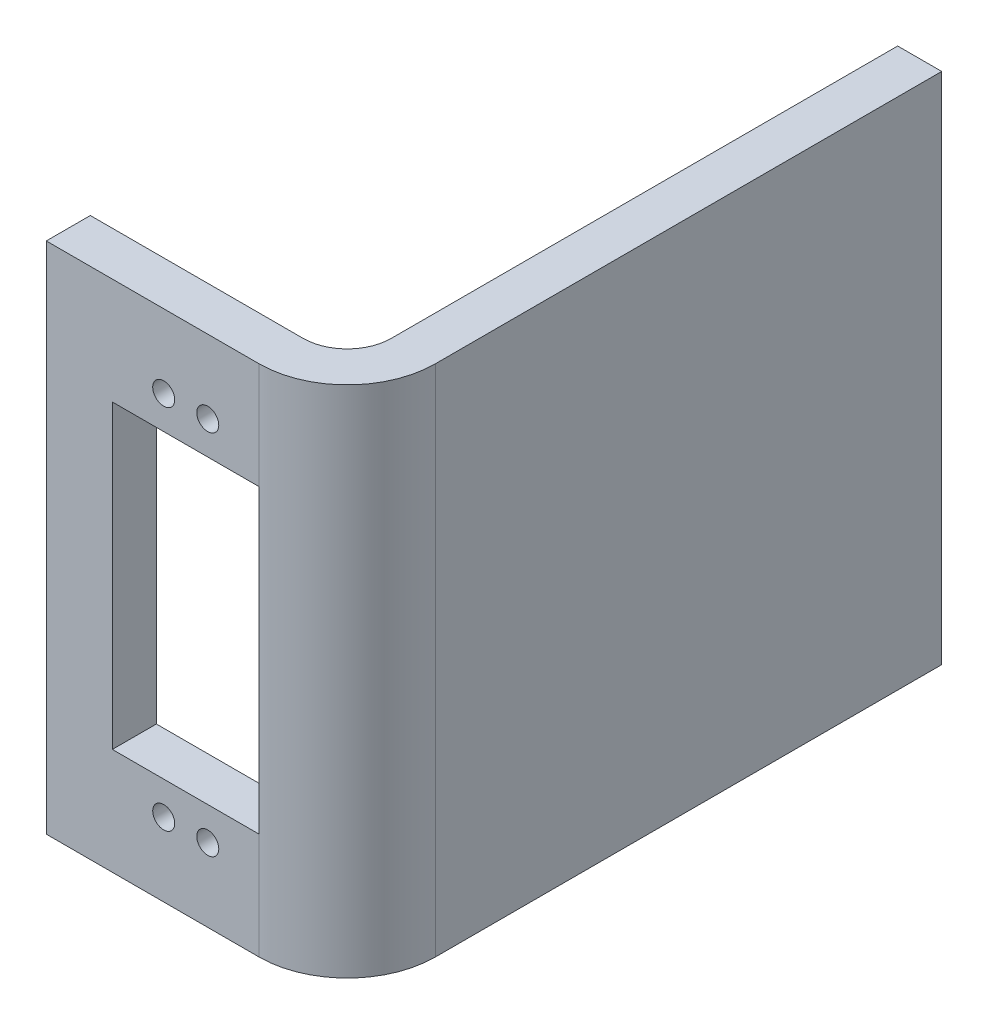
ISO-10303-21;
HEADER;
FILE_DESCRIPTION(('STEP AP214'),'2;1');
FILE_NAME('part.step','',(''),(''),'','','');
FILE_SCHEMA(('AUTOMOTIVE_DESIGN { 1 0 10303 214 1 1 1 1 }'));
ENDSEC;
DATA;
#1=APPLICATION_CONTEXT('core data for automotive mechanical design processes');
#2=APPLICATION_PROTOCOL_DEFINITION('international standard','automotive_design',2000,#1);
#3=PRODUCT_CONTEXT('',#1,'mechanical');
#4=PRODUCT('Part','Part','',(#3));
#5=PRODUCT_RELATED_PRODUCT_CATEGORY('part','',(#4));
#6=PRODUCT_DEFINITION_FORMATION('','',#4);
#7=PRODUCT_DEFINITION_CONTEXT('part definition',#1,'design');
#8=PRODUCT_DEFINITION('design','',#6,#7);
#9=PRODUCT_DEFINITION_SHAPE('','',#8);
#10=(LENGTH_UNIT() NAMED_UNIT(*) SI_UNIT(.MILLI.,.METRE.));
#11=(NAMED_UNIT(*) PLANE_ANGLE_UNIT() SI_UNIT($,.RADIAN.));
#12=(NAMED_UNIT(*) SI_UNIT($,.STERADIAN.) SOLID_ANGLE_UNIT());
#13=UNCERTAINTY_MEASURE_WITH_UNIT(LENGTH_MEASURE(1.E-05),#10,'distance_accuracy_value','');
#14=(GEOMETRIC_REPRESENTATION_CONTEXT(3) GLOBAL_UNCERTAINTY_ASSIGNED_CONTEXT((#13)) GLOBAL_UNIT_ASSIGNED_CONTEXT((#10,
#11,#12)) REPRESENTATION_CONTEXT('',''));
#15=CARTESIAN_POINT('',(0.,0.,0.));
#16=DIRECTION('',(0.,0.,1.));
#17=DIRECTION('',(1.,0.,0.));
#18=AXIS2_PLACEMENT_3D('',#15,#16,#17);
#19=CARTESIAN_POINT('',(-5.99999999999999,70.,69.));
#20=DIRECTION('',(0.,-1.,0.));
#21=DIRECTION('',(0.,0.,-1.));
#22=AXIS2_PLACEMENT_3D('',#19,#20,#21);
#23=CYLINDRICAL_SURFACE('',#22,12.);
#24=CARTESIAN_POINT('',(-5.99999999999999,0.,69.));
#25=DIRECTION('',(0.,1.,0.));
#26=DIRECTION('',(0.,0.,1.));
#27=AXIS2_PLACEMENT_3D('',#24,#25,#26);
#28=CIRCLE('',#27,12.);
#29=CARTESIAN_POINT('',(6.,0.,68.9999999999999));
#30=VERTEX_POINT('',#29);
#31=CARTESIAN_POINT('',(-6.00000000000008,0.,81.));
#32=VERTEX_POINT('',#31);
#33=EDGE_CURVE('E184',#30,#32,#28,.F.);
#34=ORIENTED_EDGE('',*,*,#33,.F.);
#35=DIRECTION('',(0.,-1.,0.));
#36=VECTOR('',#35,1.);
#37=CARTESIAN_POINT('',(6.,70.,68.9999999999999));
#38=LINE('',#37,#36);
#39=CARTESIAN_POINT('',(6.,70.,68.9999999999999));
#40=VERTEX_POINT('',#39);
#41=EDGE_CURVE('E11',#40,#30,#38,.T.);
#42=ORIENTED_EDGE('',*,*,#41,.F.);
#43=CARTESIAN_POINT('',(-5.99999999999999,70.,69.));
#44=DIRECTION('',(0.,1.,0.));
#45=DIRECTION('',(0.,0.,1.));
#46=AXIS2_PLACEMENT_3D('',#43,#44,#45);
#47=CIRCLE('',#46,12.);
#48=CARTESIAN_POINT('',(-6.00000000000008,70.,81.));
#49=VERTEX_POINT('',#48);
#50=EDGE_CURVE('E185',#40,#49,#47,.F.);
#51=ORIENTED_EDGE('',*,*,#50,.T.);
#52=DIRECTION('',(0.,-1.,0.));
#53=VECTOR('',#52,1.);
#54=CARTESIAN_POINT('',(-6.00000000000008,70.,81.));
#55=LINE('',#54,#53);
#56=CARTESIAN_POINT('',(-6.00000000000008,55.5,81.));
#57=VERTEX_POINT('',#56);
#58=EDGE_CURVE('E227',#49,#57,#55,.T.);
#59=ORIENTED_EDGE('',*,*,#58,.T.);
#60=DIRECTION('',(0.,1.,0.));
#61=VECTOR('',#60,1.);
#62=CARTESIAN_POINT('',(-6.00000000000008,55.5,81.));
#63=LINE('',#62,#61);
#64=CARTESIAN_POINT('',(-6.00000000000007,14.5,81.));
#65=VERTEX_POINT('',#64);
#66=EDGE_CURVE('E56',#65,#57,#63,.T.);
#67=ORIENTED_EDGE('',*,*,#66,.F.);
#68=EDGE_CURVE('E206',#65,#32,#55,.T.);
#69=ORIENTED_EDGE('',*,*,#68,.T.);
#70=EDGE_LOOP('',(#34,#42,#51,#59,#67,#69));
#71=FACE_BOUND('',#70,.T.);
#72=ADVANCED_FACE('F34',(#71),#23,.T.);
#73=CARTESIAN_POINT('',(6.,70.,0.));
#74=DIRECTION('',(1.,0.,0.));
#75=DIRECTION('',(0.,0.,-1.));
#76=AXIS2_PLACEMENT_3D('',#73,#74,#75);
#77=PLANE('',#76);
#78=DIRECTION('',(0.,0.,1.));
#79=VECTOR('',#78,1.);
#80=CARTESIAN_POINT('',(6.,0.,0.));
#81=LINE('',#80,#79);
#82=CARTESIAN_POINT('',(6.,0.,0.));
#83=VERTEX_POINT('',#82);
#84=EDGE_CURVE('E209',#83,#30,#81,.T.);
#85=ORIENTED_EDGE('',*,*,#84,.F.);
#86=DIRECTION('',(0.,-1.,0.));
#87=VECTOR('',#86,1.);
#88=CARTESIAN_POINT('',(6.,70.,0.));
#89=LINE('',#88,#87);
#90=CARTESIAN_POINT('',(6.,70.,0.));
#91=VERTEX_POINT('',#90);
#92=EDGE_CURVE('E41',#91,#83,#89,.T.);
#93=ORIENTED_EDGE('',*,*,#92,.F.);
#94=DIRECTION('',(0.,0.,1.));
#95=VECTOR('',#94,1.);
#96=CARTESIAN_POINT('',(6.,70.,0.));
#97=LINE('',#96,#95);
#98=EDGE_CURVE('E188',#91,#40,#97,.T.);
#99=ORIENTED_EDGE('',*,*,#98,.T.);
#100=ORIENTED_EDGE('',*,*,#41,.T.);
#101=EDGE_LOOP('',(#85,#93,#99,#100));
#102=FACE_BOUND('',#101,.T.);
#103=ADVANCED_FACE('F249',(#102),#77,.T.);
#104=CARTESIAN_POINT('',(0.,70.,0.));
#105=DIRECTION('',(0.,0.,-1.));
#106=DIRECTION('',(-1.,0.,0.));
#107=AXIS2_PLACEMENT_3D('',#104,#105,#106);
#108=PLANE('',#107);
#109=DIRECTION('',(1.,0.,0.));
#110=VECTOR('',#109,1.);
#111=CARTESIAN_POINT('',(0.,0.,0.));
#112=LINE('',#111,#110);
#113=CARTESIAN_POINT('',(0.,0.,0.));
#114=VERTEX_POINT('',#113);
#115=EDGE_CURVE('E212',#114,#83,#112,.T.);
#116=ORIENTED_EDGE('',*,*,#115,.F.);
#117=DIRECTION('',(0.,-1.,0.));
#118=VECTOR('',#117,1.);
#119=CARTESIAN_POINT('',(0.,70.,0.));
#120=LINE('',#119,#118);
#121=CARTESIAN_POINT('',(0.,70.,0.));
#122=VERTEX_POINT('',#121);
#123=EDGE_CURVE('E241',#122,#114,#120,.T.);
#124=ORIENTED_EDGE('',*,*,#123,.F.);
#125=DIRECTION('',(1.,0.,0.));
#126=VECTOR('',#125,1.);
#127=CARTESIAN_POINT('',(0.,70.,0.));
#128=LINE('',#127,#126);
#129=EDGE_CURVE('E192',#122,#91,#128,.T.);
#130=ORIENTED_EDGE('',*,*,#129,.T.);
#131=ORIENTED_EDGE('',*,*,#92,.T.);
#132=EDGE_LOOP('',(#116,#124,#130,#131));
#133=FACE_BOUND('',#132,.T.);
#134=ADVANCED_FACE('F245',(#133),#108,.T.);
#135=CARTESIAN_POINT('',(0.,70.,0.));
#136=DIRECTION('',(1.,0.,0.));
#137=DIRECTION('',(0.,0.,-1.));
#138=AXIS2_PLACEMENT_3D('',#135,#136,#137);
#139=PLANE('',#138);
#140=DIRECTION('',(0.,0.,1.));
#141=VECTOR('',#140,1.);
#142=CARTESIAN_POINT('',(0.,0.,0.));
#143=LINE('',#142,#141);
#144=CARTESIAN_POINT('',(0.,0.,68.9999999999999));
#145=VERTEX_POINT('',#144);
#146=EDGE_CURVE('E215',#114,#145,#143,.T.);
#147=ORIENTED_EDGE('',*,*,#146,.T.);
#148=DIRECTION('',(0.,-1.,0.));
#149=VECTOR('',#148,1.);
#150=CARTESIAN_POINT('',(0.,70.,68.9999999999999));
#151=LINE('',#150,#149);
#152=CARTESIAN_POINT('',(0.,70.,68.9999999999999));
#153=VERTEX_POINT('',#152);
#154=EDGE_CURVE('E238',#153,#145,#151,.T.);
#155=ORIENTED_EDGE('',*,*,#154,.F.);
#156=DIRECTION('',(0.,0.,1.));
#157=VECTOR('',#156,1.);
#158=CARTESIAN_POINT('',(0.,70.,0.));
#159=LINE('',#158,#157);
#160=EDGE_CURVE('E195',#122,#153,#159,.T.);
#161=ORIENTED_EDGE('',*,*,#160,.F.);
#162=ORIENTED_EDGE('',*,*,#123,.T.);
#163=EDGE_LOOP('',(#147,#155,#161,#162));
#164=FACE_BOUND('',#163,.T.);
#165=ADVANCED_FACE('F258',(#164),#139,.F.);
#166=CARTESIAN_POINT('',(-5.99999999999999,70.,69.));
#167=DIRECTION('',(0.,-1.,0.));
#168=DIRECTION('',(0.,0.,-1.));
#169=AXIS2_PLACEMENT_3D('',#166,#167,#168);
#170=CYLINDRICAL_SURFACE('',#169,5.99999999999999);
#171=CARTESIAN_POINT('',(-5.99999999999999,0.,69.));
#172=DIRECTION('',(0.,1.,0.));
#173=DIRECTION('',(0.,0.,1.));
#174=AXIS2_PLACEMENT_3D('',#171,#172,#173);
#175=CIRCLE('',#174,5.99999999999999);
#176=CARTESIAN_POINT('',(-6.00000000000003,0.,75.));
#177=VERTEX_POINT('',#176);
#178=EDGE_CURVE('E217',#145,#177,#175,.F.);
#179=ORIENTED_EDGE('',*,*,#178,.T.);
#180=DIRECTION('',(0.,-1.,0.));
#181=VECTOR('',#180,1.);
#182=CARTESIAN_POINT('',(-6.00000000000003,70.,75.));
#183=LINE('',#182,#181);
#184=CARTESIAN_POINT('',(-6.00000000000007,14.5,75.));
#185=VERTEX_POINT('',#184);
#186=EDGE_CURVE('E234',#185,#177,#183,.T.);
#187=ORIENTED_EDGE('',*,*,#186,.F.);
#188=DIRECTION('',(0.,1.,0.));
#189=VECTOR('',#188,1.);
#190=CARTESIAN_POINT('',(-6.00000000000008,70.,75.));
#191=LINE('',#190,#189);
#192=CARTESIAN_POINT('',(-6.00000000000008,55.5,75.));
#193=VERTEX_POINT('',#192);
#194=EDGE_CURVE('E157',#185,#193,#191,.T.);
#195=ORIENTED_EDGE('',*,*,#194,.T.);
#196=CARTESIAN_POINT('',(-6.00000000000003,70.,75.));
#197=VERTEX_POINT('',#196);
#198=EDGE_CURVE('E235',#197,#193,#183,.T.);
#199=ORIENTED_EDGE('',*,*,#198,.F.);
#200=CARTESIAN_POINT('',(-5.99999999999999,70.,69.));
#201=DIRECTION('',(0.,1.,0.));
#202=DIRECTION('',(0.,0.,1.));
#203=AXIS2_PLACEMENT_3D('',#200,#201,#202);
#204=CIRCLE('',#203,5.99999999999999);
#205=EDGE_CURVE('E197',#153,#197,#204,.F.);
#206=ORIENTED_EDGE('',*,*,#205,.F.);
#207=ORIENTED_EDGE('',*,*,#154,.T.);
#208=EDGE_LOOP('',(#179,#187,#195,#199,#206,#207));
#209=FACE_BOUND('',#208,.T.);
#210=ADVANCED_FACE('F262',(#209),#170,.F.);
#211=CARTESIAN_POINT('',(0.,70.,75.));
#212=DIRECTION('',(0.,0.,1.));
#213=DIRECTION('',(1.,0.,0.));
#214=AXIS2_PLACEMENT_3D('',#211,#212,#213);
#215=PLANE('',#214);
#216=CARTESIAN_POINT('',(-19.0000000000001,10.,75.));
#217=DIRECTION('',(0.,0.,1.));
#218=DIRECTION('',(1.,0.,0.));
#219=AXIS2_PLACEMENT_3D('',#216,#217,#218);
#220=CIRCLE('',#219,1.5);
#221=CARTESIAN_POINT('',(-17.5000000000001,10.,75.));
#222=VERTEX_POINT('',#221);
#223=EDGE_CURVE('E163',#222,#222,#220,.T.);
#224=ORIENTED_EDGE('',*,*,#223,.T.);
#225=EDGE_LOOP('',(#224));
#226=FACE_BOUND('',#225,.T.);
#227=CARTESIAN_POINT('',(-13.0000000000001,10.,75.));
#228=DIRECTION('',(0.,0.,1.));
#229=DIRECTION('',(1.,0.,0.));
#230=AXIS2_PLACEMENT_3D('',#227,#228,#229);
#231=CIRCLE('',#230,1.5);
#232=CARTESIAN_POINT('',(-11.5000000000001,10.,75.));
#233=VERTEX_POINT('',#232);
#234=EDGE_CURVE('E169',#233,#233,#231,.T.);
#235=ORIENTED_EDGE('',*,*,#234,.T.);
#236=EDGE_LOOP('',(#235));
#237=FACE_BOUND('',#236,.T.);
#238=CARTESIAN_POINT('',(-13.0000000000001,60.,75.));
#239=DIRECTION('',(0.,0.,1.));
#240=DIRECTION('',(1.,0.,0.));
#241=AXIS2_PLACEMENT_3D('',#238,#239,#240);
#242=CIRCLE('',#241,1.5);
#243=CARTESIAN_POINT('',(-11.5000000000001,60.,75.));
#244=VERTEX_POINT('',#243);
#245=EDGE_CURVE('E175',#244,#244,#242,.T.);
#246=ORIENTED_EDGE('',*,*,#245,.T.);
#247=EDGE_LOOP('',(#246));
#248=FACE_BOUND('',#247,.T.);
#249=CARTESIAN_POINT('',(-19.0000000000001,60.,75.));
#250=DIRECTION('',(0.,0.,1.));
#251=DIRECTION('',(1.,0.,0.));
#252=AXIS2_PLACEMENT_3D('',#249,#250,#251);
#253=CIRCLE('',#252,1.5);
#254=CARTESIAN_POINT('',(-17.5000000000001,60.,75.));
#255=VERTEX_POINT('',#254);
#256=EDGE_CURVE('E181',#255,#255,#253,.T.);
#257=ORIENTED_EDGE('',*,*,#256,.T.);
#258=EDGE_LOOP('',(#257));
#259=FACE_BOUND('',#258,.T.);
#260=DIRECTION('',(0.,-1.,0.));
#261=VECTOR('',#260,1.);
#262=CARTESIAN_POINT('',(-26.0000000000001,70.,75.));
#263=LINE('',#262,#261);
#264=CARTESIAN_POINT('',(-26.0000000000001,55.5,75.));
#265=VERTEX_POINT('',#264);
#266=CARTESIAN_POINT('',(-26.0000000000001,14.5,75.));
#267=VERTEX_POINT('',#266);
#268=EDGE_CURVE('E127',#265,#267,#263,.T.);
#269=ORIENTED_EDGE('',*,*,#268,.T.);
#270=DIRECTION('',(1.,0.,0.));
#271=VECTOR('',#270,1.);
#272=CARTESIAN_POINT('',(0.,14.5,75.));
#273=LINE('',#272,#271);
#274=EDGE_CURVE('E154',#267,#185,#273,.T.);
#275=ORIENTED_EDGE('',*,*,#274,.T.);
#276=ORIENTED_EDGE('',*,*,#186,.T.);
#277=DIRECTION('',(-1.,0.,0.));
#278=VECTOR('',#277,1.);
#279=CARTESIAN_POINT('',(0.,0.,75.));
#280=LINE('',#279,#278);
#281=CARTESIAN_POINT('',(-35.,0.,75.));
#282=VERTEX_POINT('',#281);
#283=EDGE_CURVE('E220',#177,#282,#280,.T.);
#284=ORIENTED_EDGE('',*,*,#283,.T.);
#285=DIRECTION('',(0.,-1.,0.));
#286=VECTOR('',#285,1.);
#287=CARTESIAN_POINT('',(-35.,70.,75.));
#288=LINE('',#287,#286);
#289=CARTESIAN_POINT('',(-35.,70.,75.));
#290=VERTEX_POINT('',#289);
#291=EDGE_CURVE('E231',#290,#282,#288,.T.);
#292=ORIENTED_EDGE('',*,*,#291,.F.);
#293=DIRECTION('',(-1.,0.,0.));
#294=VECTOR('',#293,1.);
#295=CARTESIAN_POINT('',(0.,70.,75.));
#296=LINE('',#295,#294);
#297=EDGE_CURVE('E199',#197,#290,#296,.T.);
#298=ORIENTED_EDGE('',*,*,#297,.F.);
#299=ORIENTED_EDGE('',*,*,#198,.T.);
#300=DIRECTION('',(-1.,0.,0.));
#301=VECTOR('',#300,1.);
#302=CARTESIAN_POINT('',(0.,55.5,75.));
#303=LINE('',#302,#301);
#304=EDGE_CURVE('E149',#193,#265,#303,.T.);
#305=ORIENTED_EDGE('',*,*,#304,.T.);
#306=EDGE_LOOP('',(#269,#275,#276,#284,#292,#298,#299,#305));
#307=FACE_BOUND('',#306,.T.);
#308=ADVANCED_FACE('F279',(#226,#237,#248,#259,#307),#215,.F.);
#309=CARTESIAN_POINT('',(-35.0000000000001,70.,0.));
#310=DIRECTION('',(1.,0.,0.));
#311=DIRECTION('',(0.,0.,-1.));
#312=AXIS2_PLACEMENT_3D('',#309,#310,#311);
#313=PLANE('',#312);
#314=DIRECTION('',(0.,0.,1.));
#315=VECTOR('',#314,1.);
#316=CARTESIAN_POINT('',(-35.0000000000001,0.,0.));
#317=LINE('',#316,#315);
#318=CARTESIAN_POINT('',(-35.,0.,81.));
#319=VERTEX_POINT('',#318);
#320=EDGE_CURVE('E222',#282,#319,#317,.T.);
#321=ORIENTED_EDGE('',*,*,#320,.T.);
#322=DIRECTION('',(0.,-1.,0.));
#323=VECTOR('',#322,1.);
#324=CARTESIAN_POINT('',(-35.,70.,81.));
#325=LINE('',#324,#323);
#326=CARTESIAN_POINT('',(-35.,70.,81.));
#327=VERTEX_POINT('',#326);
#328=EDGE_CURVE('E229',#327,#319,#325,.T.);
#329=ORIENTED_EDGE('',*,*,#328,.F.);
#330=DIRECTION('',(0.,0.,1.));
#331=VECTOR('',#330,1.);
#332=CARTESIAN_POINT('',(-35.0000000000001,70.,0.));
#333=LINE('',#332,#331);
#334=EDGE_CURVE('E201',#290,#327,#333,.T.);
#335=ORIENTED_EDGE('',*,*,#334,.F.);
#336=ORIENTED_EDGE('',*,*,#291,.T.);
#337=EDGE_LOOP('',(#321,#329,#335,#336));
#338=FACE_BOUND('',#337,.T.);
#339=ADVANCED_FACE('F277',(#338),#313,.F.);
#340=CARTESIAN_POINT('',(0.,70.,81.));
#341=DIRECTION('',(0.,0.,1.));
#342=DIRECTION('',(1.,0.,0.));
#343=AXIS2_PLACEMENT_3D('',#340,#341,#342);
#344=PLANE('',#343);
#345=DIRECTION('',(1.,0.,0.));
#346=VECTOR('',#345,1.);
#347=CARTESIAN_POINT('',(-26.0000000000001,14.5,81.));
#348=LINE('',#347,#346);
#349=CARTESIAN_POINT('',(-26.0000000000001,14.5,81.));
#350=VERTEX_POINT('',#349);
#351=EDGE_CURVE('E142',#350,#65,#348,.T.);
#352=ORIENTED_EDGE('',*,*,#351,.F.);
#353=DIRECTION('',(0.,-1.,0.));
#354=VECTOR('',#353,1.);
#355=CARTESIAN_POINT('',(-26.0000000000001,55.5,81.));
#356=LINE('',#355,#354);
#357=CARTESIAN_POINT('',(-26.0000000000001,55.5,81.));
#358=VERTEX_POINT('',#357);
#359=EDGE_CURVE('E124',#358,#350,#356,.T.);
#360=ORIENTED_EDGE('',*,*,#359,.F.);
#361=DIRECTION('',(-1.,0.,0.));
#362=VECTOR('',#361,1.);
#363=CARTESIAN_POINT('',(-26.0000000000001,55.5,81.));
#364=LINE('',#363,#362);
#365=EDGE_CURVE('E133',#57,#358,#364,.T.);
#366=ORIENTED_EDGE('',*,*,#365,.F.);
#367=ORIENTED_EDGE('',*,*,#58,.F.);
#368=DIRECTION('',(-1.,0.,0.));
#369=VECTOR('',#368,1.);
#370=CARTESIAN_POINT('',(0.,70.,81.));
#371=LINE('',#370,#369);
#372=EDGE_CURVE('E203',#49,#327,#371,.T.);
#373=ORIENTED_EDGE('',*,*,#372,.T.);
#374=ORIENTED_EDGE('',*,*,#328,.T.);
#375=DIRECTION('',(-1.,0.,0.));
#376=VECTOR('',#375,1.);
#377=CARTESIAN_POINT('',(0.,0.,81.));
#378=LINE('',#377,#376);
#379=EDGE_CURVE('E189',#32,#319,#378,.T.);
#380=ORIENTED_EDGE('',*,*,#379,.F.);
#381=ORIENTED_EDGE('',*,*,#68,.F.);
#382=EDGE_LOOP('',(#352,#360,#366,#367,#373,#374,#380,#381));
#383=FACE_BOUND('',#382,.T.);
#384=CARTESIAN_POINT('',(-19.0000000000001,10.,81.));
#385=DIRECTION('',(0.,0.,1.));
#386=DIRECTION('',(-1.,0.,0.));
#387=AXIS2_PLACEMENT_3D('',#384,#385,#386);
#388=CIRCLE('',#387,1.5);
#389=CARTESIAN_POINT('',(-20.5000000000001,10.,81.));
#390=VERTEX_POINT('',#389);
#391=EDGE_CURVE('E160',#390,#390,#388,.T.);
#392=ORIENTED_EDGE('',*,*,#391,.F.);
#393=EDGE_LOOP('',(#392));
#394=FACE_BOUND('',#393,.T.);
#395=CARTESIAN_POINT('',(-13.0000000000001,10.,81.));
#396=DIRECTION('',(0.,0.,1.));
#397=DIRECTION('',(1.,0.,0.));
#398=AXIS2_PLACEMENT_3D('',#395,#396,#397);
#399=CIRCLE('',#398,1.5);
#400=CARTESIAN_POINT('',(-11.5000000000001,10.,81.));
#401=VERTEX_POINT('',#400);
#402=EDGE_CURVE('E166',#401,#401,#399,.T.);
#403=ORIENTED_EDGE('',*,*,#402,.F.);
#404=EDGE_LOOP('',(#403));
#405=FACE_BOUND('',#404,.T.);
#406=CARTESIAN_POINT('',(-13.0000000000001,60.,81.));
#407=DIRECTION('',(0.,0.,1.));
#408=DIRECTION('',(-1.,0.,0.));
#409=AXIS2_PLACEMENT_3D('',#406,#407,#408);
#410=CIRCLE('',#409,1.5);
#411=CARTESIAN_POINT('',(-14.5000000000001,60.,81.));
#412=VERTEX_POINT('',#411);
#413=EDGE_CURVE('E172',#412,#412,#410,.T.);
#414=ORIENTED_EDGE('',*,*,#413,.F.);
#415=EDGE_LOOP('',(#414));
#416=FACE_BOUND('',#415,.T.);
#417=CARTESIAN_POINT('',(-19.0000000000001,60.,81.));
#418=DIRECTION('',(0.,0.,1.));
#419=DIRECTION('',(1.,0.,0.));
#420=AXIS2_PLACEMENT_3D('',#417,#418,#419);
#421=CIRCLE('',#420,1.5);
#422=CARTESIAN_POINT('',(-17.5000000000001,60.,81.));
#423=VERTEX_POINT('',#422);
#424=EDGE_CURVE('E178',#423,#423,#421,.T.);
#425=ORIENTED_EDGE('',*,*,#424,.F.);
#426=EDGE_LOOP('',(#425));
#427=FACE_BOUND('',#426,.T.);
#428=ADVANCED_FACE('F138',(#383,#394,#405,#416,#427),#344,.T.);
#429=CARTESIAN_POINT('',(0.,70.,0.));
#430=DIRECTION('',(0.,1.,0.));
#431=DIRECTION('',(0.,0.,1.));
#432=AXIS2_PLACEMENT_3D('',#429,#430,#431);
#433=PLANE('',#432);
#434=ORIENTED_EDGE('',*,*,#50,.F.);
#435=ORIENTED_EDGE('',*,*,#98,.F.);
#436=ORIENTED_EDGE('',*,*,#129,.F.);
#437=ORIENTED_EDGE('',*,*,#160,.T.);
#438=ORIENTED_EDGE('',*,*,#205,.T.);
#439=ORIENTED_EDGE('',*,*,#297,.T.);
#440=ORIENTED_EDGE('',*,*,#334,.T.);
#441=ORIENTED_EDGE('',*,*,#372,.F.);
#442=EDGE_LOOP('',(#434,#435,#436,#437,#438,#439,#440,#441));
#443=FACE_BOUND('',#442,.T.);
#444=ADVANCED_FACE('F268',(#443),#433,.T.);
#445=CARTESIAN_POINT('',(0.,0.,0.));
#446=DIRECTION('',(0.,1.,0.));
#447=DIRECTION('',(0.,0.,1.));
#448=AXIS2_PLACEMENT_3D('',#445,#446,#447);
#449=PLANE('',#448);
#450=ORIENTED_EDGE('',*,*,#33,.T.);
#451=ORIENTED_EDGE('',*,*,#379,.T.);
#452=ORIENTED_EDGE('',*,*,#320,.F.);
#453=ORIENTED_EDGE('',*,*,#283,.F.);
#454=ORIENTED_EDGE('',*,*,#178,.F.);
#455=ORIENTED_EDGE('',*,*,#146,.F.);
#456=ORIENTED_EDGE('',*,*,#115,.T.);
#457=ORIENTED_EDGE('',*,*,#84,.T.);
#458=EDGE_LOOP('',(#450,#451,#452,#453,#454,#455,#456,#457));
#459=FACE_BOUND('',#458,.T.);
#460=ADVANCED_FACE('F253',(#459),#449,.F.);
#461=CARTESIAN_POINT('',(-19.0000000000001,60.,31.));
#462=DIRECTION('',(0.,0.,1.));
#463=DIRECTION('',(1.,0.,0.));
#464=AXIS2_PLACEMENT_3D('',#461,#462,#463);
#465=CYLINDRICAL_SURFACE('',#464,1.5);
#466=ORIENTED_EDGE('',*,*,#424,.T.);
#467=EDGE_LOOP('',(#466));
#468=FACE_BOUND('',#467,.T.);
#469=ORIENTED_EDGE('',*,*,#256,.F.);
#470=EDGE_LOOP('',(#469));
#471=FACE_BOUND('',#470,.T.);
#472=ADVANCED_FACE('F318',(#468,#471),#465,.F.);
#473=CARTESIAN_POINT('',(-13.0000000000001,60.,31.));
#474=DIRECTION('',(0.,0.,1.));
#475=DIRECTION('',(1.,0.,0.));
#476=AXIS2_PLACEMENT_3D('',#473,#474,#475);
#477=CYLINDRICAL_SURFACE('',#476,1.5);
#478=ORIENTED_EDGE('',*,*,#413,.T.);
#479=EDGE_LOOP('',(#478));
#480=FACE_BOUND('',#479,.T.);
#481=ORIENTED_EDGE('',*,*,#245,.F.);
#482=EDGE_LOOP('',(#481));
#483=FACE_BOUND('',#482,.T.);
#484=ADVANCED_FACE('F323',(#480,#483),#477,.F.);
#485=CARTESIAN_POINT('',(-13.0000000000001,10.,31.));
#486=DIRECTION('',(0.,0.,1.));
#487=DIRECTION('',(1.,0.,0.));
#488=AXIS2_PLACEMENT_3D('',#485,#486,#487);
#489=CYLINDRICAL_SURFACE('',#488,1.5);
#490=ORIENTED_EDGE('',*,*,#402,.T.);
#491=EDGE_LOOP('',(#490));
#492=FACE_BOUND('',#491,.T.);
#493=ORIENTED_EDGE('',*,*,#234,.F.);
#494=EDGE_LOOP('',(#493));
#495=FACE_BOUND('',#494,.T.);
#496=ADVANCED_FACE('F292',(#492,#495),#489,.F.);
#497=CARTESIAN_POINT('',(-19.0000000000001,10.,31.));
#498=DIRECTION('',(0.,0.,1.));
#499=DIRECTION('',(1.,0.,0.));
#500=AXIS2_PLACEMENT_3D('',#497,#498,#499);
#501=CYLINDRICAL_SURFACE('',#500,1.5);
#502=ORIENTED_EDGE('',*,*,#391,.T.);
#503=EDGE_LOOP('',(#502));
#504=FACE_BOUND('',#503,.T.);
#505=ORIENTED_EDGE('',*,*,#223,.F.);
#506=EDGE_LOOP('',(#505));
#507=FACE_BOUND('',#506,.T.);
#508=ADVANCED_FACE('F284',(#504,#507),#501,.F.);
#509=CARTESIAN_POINT('',(-6.00000000000008,55.5,31.));
#510=DIRECTION('',(1.,0.,0.));
#511=DIRECTION('',(0.,1.,0.));
#512=AXIS2_PLACEMENT_3D('',#509,#510,#511);
#513=PLANE('',#512);
#514=DIRECTION('',(0.,0.,1.));
#515=VECTOR('',#514,1.);
#516=CARTESIAN_POINT('',(-6.00000000000007,14.5,31.));
#517=LINE('',#516,#515);
#518=EDGE_CURVE('E147',#185,#65,#517,.T.);
#519=ORIENTED_EDGE('',*,*,#518,.T.);
#520=ORIENTED_EDGE('',*,*,#66,.T.);
#521=DIRECTION('',(0.,0.,1.));
#522=VECTOR('',#521,1.);
#523=CARTESIAN_POINT('',(-6.00000000000008,55.5,31.));
#524=LINE('',#523,#522);
#525=EDGE_CURVE('E130',#193,#57,#524,.T.);
#526=ORIENTED_EDGE('',*,*,#525,.F.);
#527=ORIENTED_EDGE('',*,*,#194,.F.);
#528=EDGE_LOOP('',(#519,#520,#526,#527));
#529=FACE_BOUND('',#528,.T.);
#530=ADVANCED_FACE('F281',(#529),#513,.F.);
#531=CARTESIAN_POINT('',(-26.0000000000001,14.5,31.));
#532=DIRECTION('',(0.,-1.,0.));
#533=DIRECTION('',(0.,0.,-1.));
#534=AXIS2_PLACEMENT_3D('',#531,#532,#533);
#535=PLANE('',#534);
#536=DIRECTION('',(0.,0.,1.));
#537=VECTOR('',#536,1.);
#538=CARTESIAN_POINT('',(-26.0000000000001,14.5,31.));
#539=LINE('',#538,#537);
#540=EDGE_CURVE('E129',#267,#350,#539,.T.);
#541=ORIENTED_EDGE('',*,*,#540,.T.);
#542=ORIENTED_EDGE('',*,*,#351,.T.);
#543=ORIENTED_EDGE('',*,*,#518,.F.);
#544=ORIENTED_EDGE('',*,*,#274,.F.);
#545=EDGE_LOOP('',(#541,#542,#543,#544));
#546=FACE_BOUND('',#545,.T.);
#547=ADVANCED_FACE('F283',(#546),#535,.F.);
#548=CARTESIAN_POINT('',(-26.0000000000001,55.5,31.));
#549=DIRECTION('',(-1.,0.,0.));
#550=DIRECTION('',(0.,-1.,0.));
#551=AXIS2_PLACEMENT_3D('',#548,#549,#550);
#552=PLANE('',#551);
#553=DIRECTION('',(0.,0.,1.));
#554=VECTOR('',#553,1.);
#555=CARTESIAN_POINT('',(-26.0000000000001,55.5,31.));
#556=LINE('',#555,#554);
#557=EDGE_CURVE('E48',#265,#358,#556,.T.);
#558=ORIENTED_EDGE('',*,*,#557,.T.);
#559=ORIENTED_EDGE('',*,*,#359,.T.);
#560=ORIENTED_EDGE('',*,*,#540,.F.);
#561=ORIENTED_EDGE('',*,*,#268,.F.);
#562=EDGE_LOOP('',(#558,#559,#560,#561));
#563=FACE_BOUND('',#562,.T.);
#564=ADVANCED_FACE('F121',(#563),#552,.F.);
#565=CARTESIAN_POINT('',(-26.0000000000001,55.5,31.));
#566=DIRECTION('',(0.,1.,0.));
#567=DIRECTION('',(0.,0.,1.));
#568=AXIS2_PLACEMENT_3D('',#565,#566,#567);
#569=PLANE('',#568);
#570=ORIENTED_EDGE('',*,*,#525,.T.);
#571=ORIENTED_EDGE('',*,*,#365,.T.);
#572=ORIENTED_EDGE('',*,*,#557,.F.);
#573=ORIENTED_EDGE('',*,*,#304,.F.);
#574=EDGE_LOOP('',(#570,#571,#572,#573));
#575=FACE_BOUND('',#574,.T.);
#576=ADVANCED_FACE('F134',(#575),#569,.F.);
#577=CLOSED_SHELL('',(#72,#103,#134,#165,#210,#308,#339,#428,#444,#460,#472,#484,#496,#508,#530,
#547,#564,#576));
#578=MANIFOLD_SOLID_BREP('B2',#577);
#579=ADVANCED_BREP_SHAPE_REPRESENTATION('',(#18,#578),#14);
#580=SHAPE_DEFINITION_REPRESENTATION(#9,#579);
ENDSEC;
END-ISO-10303-21;
